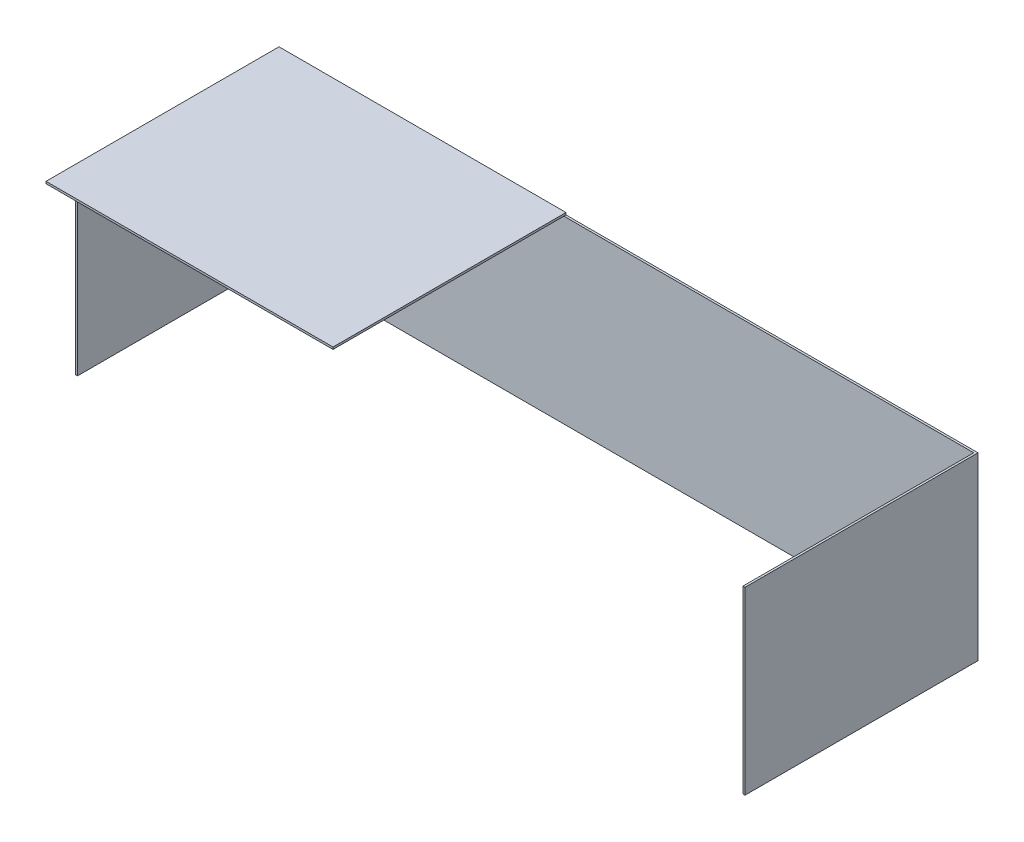
ISO-10303-21;
HEADER;
FILE_DESCRIPTION(('STEP AP214'),'2;1');
FILE_NAME('part.step','',(''),(''),'','','');
FILE_SCHEMA(('AUTOMOTIVE_DESIGN { 1 0 10303 214 1 1 1 1 }'));
ENDSEC;
DATA;
#1=APPLICATION_CONTEXT('core data for automotive mechanical design processes');
#2=APPLICATION_PROTOCOL_DEFINITION('international standard','automotive_design',2000,#1);
#3=PRODUCT_CONTEXT('',#1,'mechanical');
#4=PRODUCT('Part','Part','',(#3));
#5=PRODUCT_RELATED_PRODUCT_CATEGORY('part','',(#4));
#6=PRODUCT_DEFINITION_FORMATION('','',#4);
#7=PRODUCT_DEFINITION_CONTEXT('part definition',#1,'design');
#8=PRODUCT_DEFINITION('design','',#6,#7);
#9=PRODUCT_DEFINITION_SHAPE('','',#8);
#10=(LENGTH_UNIT() NAMED_UNIT(*) SI_UNIT(.MILLI.,.METRE.));
#11=(NAMED_UNIT(*) PLANE_ANGLE_UNIT() SI_UNIT($,.RADIAN.));
#12=(NAMED_UNIT(*) SI_UNIT($,.STERADIAN.) SOLID_ANGLE_UNIT());
#13=UNCERTAINTY_MEASURE_WITH_UNIT(LENGTH_MEASURE(1.E-05),#10,'distance_accuracy_value','');
#14=(GEOMETRIC_REPRESENTATION_CONTEXT(3) GLOBAL_UNCERTAINTY_ASSIGNED_CONTEXT((#13)) GLOBAL_UNIT_ASSIGNED_CONTEXT((#10,
#11,#12)) REPRESENTATION_CONTEXT('',''));
#15=CARTESIAN_POINT('',(0.,0.,0.));
#16=DIRECTION('',(0.,0.,1.));
#17=DIRECTION('',(1.,0.,0.));
#18=AXIS2_PLACEMENT_3D('',#15,#16,#17);
#19=CARTESIAN_POINT('',(-307.737821636415,170.,89.6137145212522));
#20=DIRECTION('',(1.,0.,0.));
#21=DIRECTION('',(0.,0.,-1.));
#22=AXIS2_PLACEMENT_3D('',#19,#20,#21);
#23=PLANE('',#22);
#24=DIRECTION('',(0.,0.,1.));
#25=VECTOR('',#24,1.);
#26=CARTESIAN_POINT('',(-307.737821636415,0.,89.6137145212522));
#27=LINE('',#26,#25);
#28=CARTESIAN_POINT('',(-307.737821636415,0.,-102.579273878805));
#29=VERTEX_POINT('',#28);
#30=CARTESIAN_POINT('',(-307.737821636415,0.,89.6137145212522));
#31=VERTEX_POINT('',#30);
#32=EDGE_CURVE('E141',#29,#31,#27,.T.);
#33=ORIENTED_EDGE('',*,*,#32,.T.);
#34=DIRECTION('',(0.,-1.,0.));
#35=VECTOR('',#34,1.);
#36=CARTESIAN_POINT('',(-307.737821636415,170.,89.6137145212522));
#37=LINE('',#36,#35);
#38=CARTESIAN_POINT('',(-307.737821636415,170.,89.6137145212522));
#39=VERTEX_POINT('',#38);
#40=EDGE_CURVE('E36',#39,#31,#37,.T.);
#41=ORIENTED_EDGE('',*,*,#40,.F.);
#42=DIRECTION('',(0.,0.,1.));
#43=VECTOR('',#42,1.);
#44=CARTESIAN_POINT('',(-307.737821636415,170.,-102.579273878805));
#45=LINE('',#44,#43);
#46=CARTESIAN_POINT('',(-307.737821636415,170.,117.420726121195));
#47=VERTEX_POINT('',#46);
#48=EDGE_CURVE('E206',#39,#47,#45,.T.);
#49=ORIENTED_EDGE('',*,*,#48,.T.);
#50=DIRECTION('',(0.,-1.,0.));
#51=VECTOR('',#50,1.);
#52=CARTESIAN_POINT('',(-307.737821636415,172.,117.420726121195));
#53=LINE('',#52,#51);
#54=CARTESIAN_POINT('',(-307.737821636415,172.,117.420726121195));
#55=VERTEX_POINT('',#54);
#56=EDGE_CURVE('E145',#55,#47,#53,.T.);
#57=ORIENTED_EDGE('',*,*,#56,.F.);
#58=DIRECTION('',(0.,0.,1.));
#59=VECTOR('',#58,1.);
#60=CARTESIAN_POINT('',(-307.737821636415,172.,-102.579273878805));
#61=LINE('',#60,#59);
#62=CARTESIAN_POINT('',(-307.737821636415,172.,-102.579273878805));
#63=VERTEX_POINT('',#62);
#64=EDGE_CURVE('E202',#63,#55,#61,.T.);
#65=ORIENTED_EDGE('',*,*,#64,.F.);
#66=DIRECTION('',(0.,-1.,0.));
#67=VECTOR('',#66,1.);
#68=CARTESIAN_POINT('',(-307.737821636415,170.,-102.579273878805));
#69=LINE('',#68,#67);
#70=EDGE_CURVE('E140',#63,#29,#69,.T.);
#71=ORIENTED_EDGE('',*,*,#70,.T.);
#72=EDGE_LOOP('',(#33,#41,#49,#57,#65,#71));
#73=FACE_BOUND('',#72,.T.);
#74=ADVANCED_FACE('F33',(#73),#23,.F.);
#75=CARTESIAN_POINT('',(-307.737821636415,170.,89.6137145212522));
#76=DIRECTION('',(0.,0.,-1.));
#77=DIRECTION('',(-1.,0.,0.));
#78=AXIS2_PLACEMENT_3D('',#75,#76,#77);
#79=PLANE('',#78);
#80=DIRECTION('',(1.,0.,0.));
#81=VECTOR('',#80,1.);
#82=CARTESIAN_POINT('',(-307.737821636415,0.,89.6137145212522));
#83=LINE('',#82,#81);
#84=CARTESIAN_POINT('',(-305.737821636415,0.,89.6137145212522));
#85=VERTEX_POINT('',#84);
#86=EDGE_CURVE('E144',#31,#85,#83,.T.);
#87=ORIENTED_EDGE('',*,*,#86,.T.);
#88=DIRECTION('',(0.,-1.,0.));
#89=VECTOR('',#88,1.);
#90=CARTESIAN_POINT('',(-305.737821636415,170.,89.6137145212522));
#91=LINE('',#90,#89);
#92=CARTESIAN_POINT('',(-305.737821636415,170.,89.6137145212522));
#93=VERTEX_POINT('',#92);
#94=EDGE_CURVE('E164',#93,#85,#91,.T.);
#95=ORIENTED_EDGE('',*,*,#94,.F.);
#96=DIRECTION('',(1.,0.,0.));
#97=VECTOR('',#96,1.);
#98=CARTESIAN_POINT('',(-307.737821636415,170.,89.6137145212522));
#99=LINE('',#98,#97);
#100=EDGE_CURVE('E97',#39,#93,#99,.T.);
#101=ORIENTED_EDGE('',*,*,#100,.F.);
#102=ORIENTED_EDGE('',*,*,#40,.T.);
#103=EDGE_LOOP('',(#87,#95,#101,#102));
#104=FACE_BOUND('',#103,.T.);
#105=ADVANCED_FACE('F169',(#104),#79,.F.);
#106=CARTESIAN_POINT('',(-305.737821636415,170.,89.6137145212522));
#107=DIRECTION('',(-1.,0.,0.));
#108=DIRECTION('',(0.,0.,1.));
#109=AXIS2_PLACEMENT_3D('',#106,#107,#108);
#110=PLANE('',#109);
#111=DIRECTION('',(0.,0.,-1.));
#112=VECTOR('',#111,1.);
#113=CARTESIAN_POINT('',(-305.737821636415,0.,89.6137145212522));
#114=LINE('',#113,#112);
#115=CARTESIAN_POINT('',(-305.737821636415,0.,-100.579273878805));
#116=VERTEX_POINT('',#115);
#117=EDGE_CURVE('E147',#85,#116,#114,.T.);
#118=ORIENTED_EDGE('',*,*,#117,.T.);
#119=DIRECTION('',(0.,-1.,0.));
#120=VECTOR('',#119,1.);
#121=CARTESIAN_POINT('',(-305.737821636415,170.,-100.579273878805));
#122=LINE('',#121,#120);
#123=CARTESIAN_POINT('',(-305.737821636415,170.,-100.579273878805));
#124=VERTEX_POINT('',#123);
#125=EDGE_CURVE('E162',#124,#116,#122,.T.);
#126=ORIENTED_EDGE('',*,*,#125,.F.);
#127=DIRECTION('',(0.,0.,-1.));
#128=VECTOR('',#127,1.);
#129=CARTESIAN_POINT('',(-305.737821636415,170.,89.6137145212522));
#130=LINE('',#129,#128);
#131=EDGE_CURVE('E188',#93,#124,#130,.T.);
#132=ORIENTED_EDGE('',*,*,#131,.F.);
#133=ORIENTED_EDGE('',*,*,#94,.T.);
#134=EDGE_LOOP('',(#118,#126,#132,#133));
#135=FACE_BOUND('',#134,.T.);
#136=ADVANCED_FACE('F179',(#135),#110,.F.);
#137=CARTESIAN_POINT('',(350.262178363585,170.,-100.579273878805));
#138=DIRECTION('',(0.,0.,-1.));
#139=DIRECTION('',(-1.,0.,0.));
#140=AXIS2_PLACEMENT_3D('',#137,#138,#139);
#141=PLANE('',#140);
#142=DIRECTION('',(1.,0.,0.));
#143=VECTOR('',#142,1.);
#144=CARTESIAN_POINT('',(350.262178363585,0.,-100.579273878805));
#145=LINE('',#144,#143);
#146=CARTESIAN_POINT('',(350.262178363585,0.,-100.579273878805));
#147=VERTEX_POINT('',#146);
#148=EDGE_CURVE('E149',#116,#147,#145,.T.);
#149=ORIENTED_EDGE('',*,*,#148,.T.);
#150=DIRECTION('',(0.,-1.,0.));
#151=VECTOR('',#150,1.);
#152=CARTESIAN_POINT('',(350.262178363585,170.,-100.579273878805));
#153=LINE('',#152,#151);
#154=CARTESIAN_POINT('',(350.262178363585,170.,-100.579273878805));
#155=VERTEX_POINT('',#154);
#156=EDGE_CURVE('E129',#155,#147,#153,.T.);
#157=ORIENTED_EDGE('',*,*,#156,.F.);
#158=DIRECTION('',(1.,0.,0.));
#159=VECTOR('',#158,1.);
#160=CARTESIAN_POINT('',(350.262178363585,170.,-100.579273878805));
#161=LINE('',#160,#159);
#162=CARTESIAN_POINT('',(-36.7257310306426,170.,-100.579273878805));
#163=VERTEX_POINT('',#162);
#164=EDGE_CURVE('E116',#163,#155,#161,.T.);
#165=ORIENTED_EDGE('',*,*,#164,.F.);
#166=EDGE_CURVE('E120',#124,#163,#161,.T.);
#167=ORIENTED_EDGE('',*,*,#166,.F.);
#168=ORIENTED_EDGE('',*,*,#125,.T.);
#169=EDGE_LOOP('',(#149,#157,#165,#167,#168));
#170=FACE_BOUND('',#169,.T.);
#171=ADVANCED_FACE('F182',(#170),#141,.F.);
#172=CARTESIAN_POINT('',(350.262178363585,170.,117.420726121195));
#173=DIRECTION('',(1.,0.,0.));
#174=DIRECTION('',(0.,0.,-1.));
#175=AXIS2_PLACEMENT_3D('',#172,#173,#174);
#176=PLANE('',#175);
#177=DIRECTION('',(0.,0.,1.));
#178=VECTOR('',#177,1.);
#179=CARTESIAN_POINT('',(350.262178363585,0.,117.420726121195));
#180=LINE('',#179,#178);
#181=CARTESIAN_POINT('',(350.262178363585,0.,117.420726121195));
#182=VERTEX_POINT('',#181);
#183=EDGE_CURVE('E126',#147,#182,#180,.T.);
#184=ORIENTED_EDGE('',*,*,#183,.T.);
#185=DIRECTION('',(0.,-1.,0.));
#186=VECTOR('',#185,1.);
#187=CARTESIAN_POINT('',(350.262178363585,170.,117.420726121195));
#188=LINE('',#187,#186);
#189=CARTESIAN_POINT('',(350.262178363585,170.,117.420726121195));
#190=VERTEX_POINT('',#189);
#191=EDGE_CURVE('E123',#190,#182,#188,.T.);
#192=ORIENTED_EDGE('',*,*,#191,.F.);
#193=DIRECTION('',(0.,0.,1.));
#194=VECTOR('',#193,1.);
#195=CARTESIAN_POINT('',(350.262178363585,170.,117.420726121195));
#196=LINE('',#195,#194);
#197=EDGE_CURVE('E110',#155,#190,#196,.T.);
#198=ORIENTED_EDGE('',*,*,#197,.F.);
#199=ORIENTED_EDGE('',*,*,#156,.T.);
#200=EDGE_LOOP('',(#184,#192,#198,#199));
#201=FACE_BOUND('',#200,.T.);
#202=ADVANCED_FACE('F124',(#201),#176,.F.);
#203=CARTESIAN_POINT('',(352.262178363585,170.,117.420726121195));
#204=DIRECTION('',(0.,0.,-1.));
#205=DIRECTION('',(-1.,0.,0.));
#206=AXIS2_PLACEMENT_3D('',#203,#204,#205);
#207=PLANE('',#206);
#208=DIRECTION('',(1.,0.,0.));
#209=VECTOR('',#208,1.);
#210=CARTESIAN_POINT('',(352.262178363585,0.,117.420726121195));
#211=LINE('',#210,#209);
#212=CARTESIAN_POINT('',(352.262178363585,0.,117.420726121195));
#213=VERTEX_POINT('',#212);
#214=EDGE_CURVE('E152',#182,#213,#211,.T.);
#215=ORIENTED_EDGE('',*,*,#214,.T.);
#216=DIRECTION('',(0.,-1.,0.));
#217=VECTOR('',#216,1.);
#218=CARTESIAN_POINT('',(352.262178363585,170.,117.420726121195));
#219=LINE('',#218,#217);
#220=CARTESIAN_POINT('',(352.262178363585,170.,117.420726121195));
#221=VERTEX_POINT('',#220);
#222=EDGE_CURVE('E130',#221,#213,#219,.T.);
#223=ORIENTED_EDGE('',*,*,#222,.F.);
#224=DIRECTION('',(1.,0.,0.));
#225=VECTOR('',#224,1.);
#226=CARTESIAN_POINT('',(352.262178363585,170.,117.420726121195));
#227=LINE('',#226,#225);
#228=EDGE_CURVE('E114',#190,#221,#227,.T.);
#229=ORIENTED_EDGE('',*,*,#228,.F.);
#230=ORIENTED_EDGE('',*,*,#191,.T.);
#231=EDGE_LOOP('',(#215,#223,#229,#230));
#232=FACE_BOUND('',#231,.T.);
#233=ADVANCED_FACE('F132',(#232),#207,.F.);
#234=CARTESIAN_POINT('',(352.262178363585,170.,117.420726121195));
#235=DIRECTION('',(-1.,0.,0.));
#236=DIRECTION('',(0.,0.,1.));
#237=AXIS2_PLACEMENT_3D('',#234,#235,#236);
#238=PLANE('',#237);
#239=DIRECTION('',(0.,0.,-1.));
#240=VECTOR('',#239,1.);
#241=CARTESIAN_POINT('',(352.262178363585,0.,117.420726121195));
#242=LINE('',#241,#240);
#243=CARTESIAN_POINT('',(352.262178363585,0.,-102.579273878805));
#244=VERTEX_POINT('',#243);
#245=EDGE_CURVE('E154',#213,#244,#242,.T.);
#246=ORIENTED_EDGE('',*,*,#245,.T.);
#247=DIRECTION('',(0.,-1.,0.));
#248=VECTOR('',#247,1.);
#249=CARTESIAN_POINT('',(352.262178363585,170.,-102.579273878805));
#250=LINE('',#249,#248);
#251=CARTESIAN_POINT('',(352.262178363585,170.,-102.579273878805));
#252=VERTEX_POINT('',#251);
#253=EDGE_CURVE('E158',#252,#244,#250,.T.);
#254=ORIENTED_EDGE('',*,*,#253,.F.);
#255=DIRECTION('',(0.,0.,-1.));
#256=VECTOR('',#255,1.);
#257=CARTESIAN_POINT('',(352.262178363585,170.,117.420726121195));
#258=LINE('',#257,#256);
#259=EDGE_CURVE('E54',#221,#252,#258,.T.);
#260=ORIENTED_EDGE('',*,*,#259,.F.);
#261=ORIENTED_EDGE('',*,*,#222,.T.);
#262=EDGE_LOOP('',(#246,#254,#260,#261));
#263=FACE_BOUND('',#262,.T.);
#264=ADVANCED_FACE('F243',(#263),#238,.F.);
#265=CARTESIAN_POINT('',(352.262178363585,170.,-102.579273878805));
#266=DIRECTION('',(0.,0.,1.));
#267=DIRECTION('',(1.,0.,0.));
#268=AXIS2_PLACEMENT_3D('',#265,#266,#267);
#269=PLANE('',#268);
#270=DIRECTION('',(-1.,0.,0.));
#271=VECTOR('',#270,1.);
#272=CARTESIAN_POINT('',(352.262178363585,0.,-102.579273878805));
#273=LINE('',#272,#271);
#274=EDGE_CURVE('E88',#244,#29,#273,.T.);
#275=ORIENTED_EDGE('',*,*,#274,.T.);
#276=ORIENTED_EDGE('',*,*,#70,.F.);
#277=DIRECTION('',(-1.,0.,0.));
#278=VECTOR('',#277,1.);
#279=CARTESIAN_POINT('',(-307.737821636415,172.,-102.579273878805));
#280=LINE('',#279,#278);
#281=CARTESIAN_POINT('',(-36.7257310306426,172.,-102.579273878805));
#282=VERTEX_POINT('',#281);
#283=EDGE_CURVE('E200',#282,#63,#280,.T.);
#284=ORIENTED_EDGE('',*,*,#283,.F.);
#285=DIRECTION('',(0.,-1.,0.));
#286=VECTOR('',#285,1.);
#287=CARTESIAN_POINT('',(-36.7257310306426,172.,-102.579273878805));
#288=LINE('',#287,#286);
#289=CARTESIAN_POINT('',(-36.7257310306426,170.,-102.579273878805));
#290=VERTEX_POINT('',#289);
#291=EDGE_CURVE('E198',#282,#290,#288,.T.);
#292=ORIENTED_EDGE('',*,*,#291,.T.);
#293=DIRECTION('',(-1.,0.,0.));
#294=VECTOR('',#293,1.);
#295=CARTESIAN_POINT('',(352.262178363585,170.,-102.579273878805));
#296=LINE('',#295,#294);
#297=EDGE_CURVE('E135',#252,#290,#296,.T.);
#298=ORIENTED_EDGE('',*,*,#297,.F.);
#299=ORIENTED_EDGE('',*,*,#253,.T.);
#300=EDGE_LOOP('',(#275,#276,#284,#292,#298,#299));
#301=FACE_BOUND('',#300,.T.);
#302=ADVANCED_FACE('F241',(#301),#269,.F.);
#303=CARTESIAN_POINT('',(0.,170.,0.));
#304=DIRECTION('',(0.,1.,0.));
#305=DIRECTION('',(0.,0.,1.));
#306=AXIS2_PLACEMENT_3D('',#303,#304,#305);
#307=PLANE('',#306);
#308=DIRECTION('',(0.,0.,-1.));
#309=VECTOR('',#308,1.);
#310=CARTESIAN_POINT('',(-36.7257310306426,170.,-102.579273878805));
#311=LINE('',#310,#309);
#312=EDGE_CURVE('E11',#163,#290,#311,.T.);
#313=ORIENTED_EDGE('',*,*,#312,.F.);
#314=ORIENTED_EDGE('',*,*,#164,.T.);
#315=ORIENTED_EDGE('',*,*,#197,.T.);
#316=ORIENTED_EDGE('',*,*,#228,.T.);
#317=ORIENTED_EDGE('',*,*,#259,.T.);
#318=ORIENTED_EDGE('',*,*,#297,.T.);
#319=EDGE_LOOP('',(#313,#314,#315,#316,#317,#318));
#320=FACE_BOUND('',#319,.T.);
#321=ADVANCED_FACE('F112',(#320),#307,.T.);
#322=CARTESIAN_POINT('',(0.,0.,0.));
#323=DIRECTION('',(0.,1.,0.));
#324=DIRECTION('',(0.,0.,1.));
#325=AXIS2_PLACEMENT_3D('',#322,#323,#324);
#326=PLANE('',#325);
#327=ORIENTED_EDGE('',*,*,#32,.F.);
#328=ORIENTED_EDGE('',*,*,#274,.F.);
#329=ORIENTED_EDGE('',*,*,#245,.F.);
#330=ORIENTED_EDGE('',*,*,#214,.F.);
#331=ORIENTED_EDGE('',*,*,#183,.F.);
#332=ORIENTED_EDGE('',*,*,#148,.F.);
#333=ORIENTED_EDGE('',*,*,#117,.F.);
#334=ORIENTED_EDGE('',*,*,#86,.F.);
#335=EDGE_LOOP('',(#327,#328,#329,#330,#331,#332,#333,#334));
#336=FACE_BOUND('',#335,.T.);
#337=ADVANCED_FACE('F176',(#336),#326,.F.);
#338=CARTESIAN_POINT('',(0.,170.,0.));
#339=DIRECTION('',(0.,1.,0.));
#340=DIRECTION('',(0.,0.,1.));
#341=AXIS2_PLACEMENT_3D('',#338,#339,#340);
#342=PLANE('',#341);
#343=ORIENTED_EDGE('',*,*,#48,.F.);
#344=ORIENTED_EDGE('',*,*,#100,.T.);
#345=ORIENTED_EDGE('',*,*,#131,.T.);
#346=ORIENTED_EDGE('',*,*,#166,.T.);
#347=CARTESIAN_POINT('',(-36.7257310306426,170.,117.420726121195));
#348=VERTEX_POINT('',#347);
#349=EDGE_CURVE('E42',#348,#163,#311,.T.);
#350=ORIENTED_EDGE('',*,*,#349,.F.);
#351=DIRECTION('',(1.,0.,0.));
#352=VECTOR('',#351,1.);
#353=CARTESIAN_POINT('',(-307.737821636415,170.,117.420726121195));
#354=LINE('',#353,#352);
#355=EDGE_CURVE('E203',#47,#348,#354,.T.);
#356=ORIENTED_EDGE('',*,*,#355,.F.);
#357=EDGE_LOOP('',(#343,#344,#345,#346,#350,#356));
#358=FACE_BOUND('',#357,.T.);
#359=ADVANCED_FACE('F189',(#358),#342,.F.);
#360=CARTESIAN_POINT('',(-307.737821636415,172.,117.420726121195));
#361=DIRECTION('',(0.,0.,-1.));
#362=DIRECTION('',(-1.,0.,0.));
#363=AXIS2_PLACEMENT_3D('',#360,#361,#362);
#364=PLANE('',#363);
#365=ORIENTED_EDGE('',*,*,#355,.T.);
#366=DIRECTION('',(0.,-1.,0.));
#367=VECTOR('',#366,1.);
#368=CARTESIAN_POINT('',(-36.7257310306426,172.,117.420726121195));
#369=LINE('',#368,#367);
#370=CARTESIAN_POINT('',(-36.7257310306426,172.,117.420726121195));
#371=VERTEX_POINT('',#370);
#372=EDGE_CURVE('E195',#371,#348,#369,.T.);
#373=ORIENTED_EDGE('',*,*,#372,.F.);
#374=DIRECTION('',(1.,0.,0.));
#375=VECTOR('',#374,1.);
#376=CARTESIAN_POINT('',(-307.737821636415,172.,117.420726121195));
#377=LINE('',#376,#375);
#378=EDGE_CURVE('E213',#55,#371,#377,.T.);
#379=ORIENTED_EDGE('',*,*,#378,.F.);
#380=ORIENTED_EDGE('',*,*,#56,.T.);
#381=EDGE_LOOP('',(#365,#373,#379,#380));
#382=FACE_BOUND('',#381,.T.);
#383=ADVANCED_FACE('F229',(#382),#364,.F.);
#384=CARTESIAN_POINT('',(-36.7257310306426,172.,-102.579273878805));
#385=DIRECTION('',(-1.,0.,0.));
#386=DIRECTION('',(0.,0.,1.));
#387=AXIS2_PLACEMENT_3D('',#384,#385,#386);
#388=PLANE('',#387);
#389=ORIENTED_EDGE('',*,*,#349,.T.);
#390=ORIENTED_EDGE('',*,*,#312,.T.);
#391=ORIENTED_EDGE('',*,*,#291,.F.);
#392=DIRECTION('',(0.,0.,-1.));
#393=VECTOR('',#392,1.);
#394=CARTESIAN_POINT('',(-36.7257310306426,172.,-102.579273878805));
#395=LINE('',#394,#393);
#396=EDGE_CURVE('E210',#371,#282,#395,.T.);
#397=ORIENTED_EDGE('',*,*,#396,.F.);
#398=ORIENTED_EDGE('',*,*,#372,.T.);
#399=EDGE_LOOP('',(#389,#390,#391,#397,#398));
#400=FACE_BOUND('',#399,.T.);
#401=ADVANCED_FACE('F239',(#400),#388,.F.);
#402=CARTESIAN_POINT('',(0.,172.,0.));
#403=DIRECTION('',(0.,1.,0.));
#404=DIRECTION('',(0.,0.,1.));
#405=AXIS2_PLACEMENT_3D('',#402,#403,#404);
#406=PLANE('',#405);
#407=ORIENTED_EDGE('',*,*,#64,.T.);
#408=ORIENTED_EDGE('',*,*,#378,.T.);
#409=ORIENTED_EDGE('',*,*,#396,.T.);
#410=ORIENTED_EDGE('',*,*,#283,.T.);
#411=EDGE_LOOP('',(#407,#408,#409,#410));
#412=FACE_BOUND('',#411,.T.);
#413=ADVANCED_FACE('F220',(#412),#406,.T.);
#414=CLOSED_SHELL('',(#74,#105,#136,#171,#202,#233,#264,#302,#321,#337,#359,#383,#401,#413));
#415=MANIFOLD_SOLID_BREP('B2',#414);
#416=ADVANCED_BREP_SHAPE_REPRESENTATION('',(#18,#415),#14);
#417=SHAPE_DEFINITION_REPRESENTATION(#9,#416);
ENDSEC;
END-ISO-10303-21;
